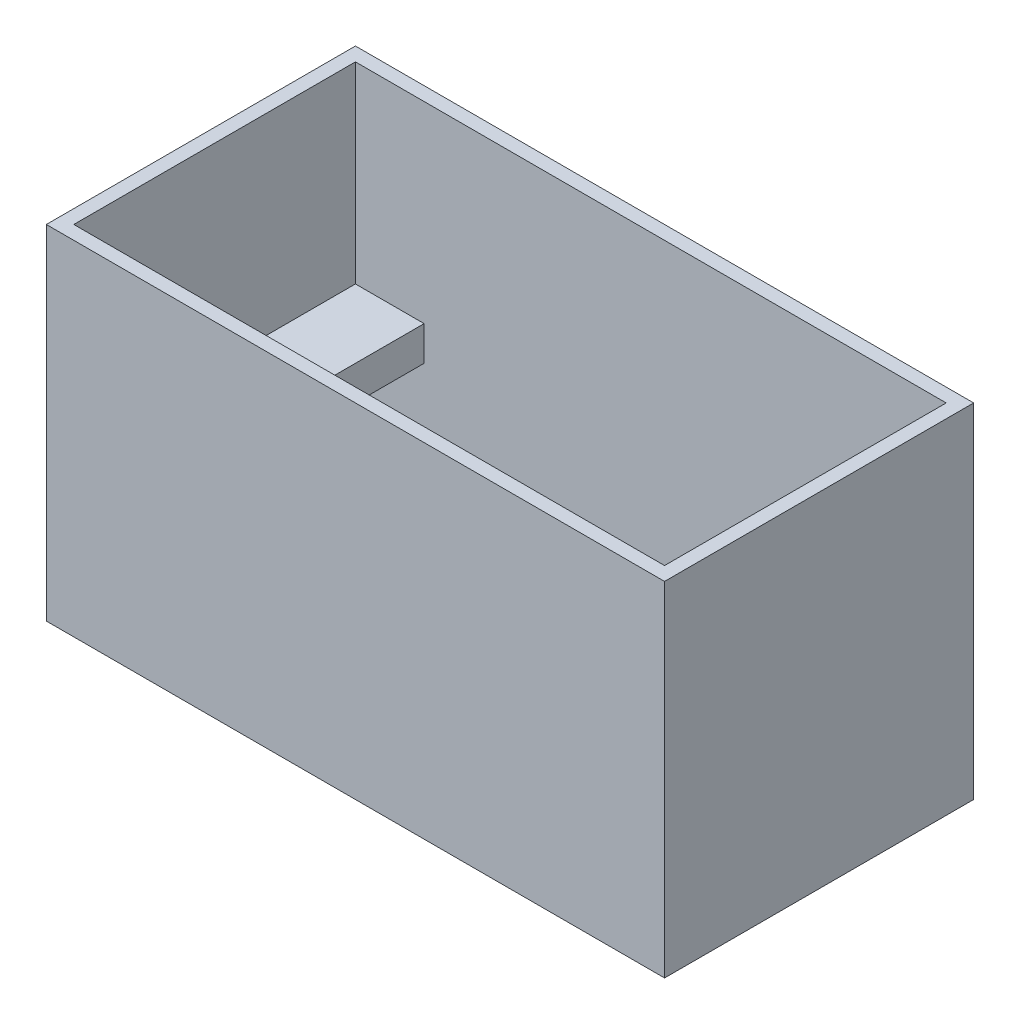
ISO-10303-21;
HEADER;
FILE_DESCRIPTION(('STEP AP214'),'2;1');
FILE_NAME('part.step','',(''),(''),'','','');
FILE_SCHEMA(('AUTOMOTIVE_DESIGN { 1 0 10303 214 1 1 1 1 }'));
ENDSEC;
DATA;
#1=APPLICATION_CONTEXT('core data for automotive mechanical design processes');
#2=APPLICATION_PROTOCOL_DEFINITION('international standard','automotive_design',2000,#1);
#3=PRODUCT_CONTEXT('',#1,'mechanical');
#4=PRODUCT('Part','Part','',(#3));
#5=PRODUCT_RELATED_PRODUCT_CATEGORY('part','',(#4));
#6=PRODUCT_DEFINITION_FORMATION('','',#4);
#7=PRODUCT_DEFINITION_CONTEXT('part definition',#1,'design');
#8=PRODUCT_DEFINITION('design','',#6,#7);
#9=PRODUCT_DEFINITION_SHAPE('','',#8);
#10=(LENGTH_UNIT() NAMED_UNIT(*) SI_UNIT(.MILLI.,.METRE.));
#11=(NAMED_UNIT(*) PLANE_ANGLE_UNIT() SI_UNIT($,.RADIAN.));
#12=(NAMED_UNIT(*) SI_UNIT($,.STERADIAN.) SOLID_ANGLE_UNIT());
#13=UNCERTAINTY_MEASURE_WITH_UNIT(LENGTH_MEASURE(1.E-05),#10,'distance_accuracy_value','');
#14=(GEOMETRIC_REPRESENTATION_CONTEXT(3) GLOBAL_UNCERTAINTY_ASSIGNED_CONTEXT((#13)) GLOBAL_UNIT_ASSIGNED_CONTEXT((#10,
#11,#12)) REPRESENTATION_CONTEXT('',''));
#15=CARTESIAN_POINT('',(0.,0.,0.));
#16=DIRECTION('',(0.,0.,1.));
#17=DIRECTION('',(1.,0.,0.));
#18=AXIS2_PLACEMENT_3D('',#15,#16,#17);
#19=CARTESIAN_POINT('',(-40.1376433452096,50.,17.0449021995127));
#20=DIRECTION('',(0.,0.,-1.));
#21=DIRECTION('',(-1.,0.,0.));
#22=AXIS2_PLACEMENT_3D('',#19,#20,#21);
#23=PLANE('',#22);
#24=DIRECTION('',(0.,-1.,0.));
#25=VECTOR('',#24,1.);
#26=CARTESIAN_POINT('',(47.8623566547904,50.,17.0449021995127));
#27=LINE('',#26,#25);
#28=CARTESIAN_POINT('',(47.8623566547904,50.,17.0449021995127));
#29=VERTEX_POINT('',#28);
#30=CARTESIAN_POINT('',(47.8623566547904,27.,17.0449021995127));
#31=VERTEX_POINT('',#30);
#32=EDGE_CURVE('E233',#29,#31,#27,.T.);
#33=ORIENTED_EDGE('',*,*,#32,.T.);
#34=DIRECTION('',(1.,0.,0.));
#35=VECTOR('',#34,1.);
#36=CARTESIAN_POINT('',(37.8623566547904,27.,17.0449021995127));
#37=LINE('',#36,#35);
#38=CARTESIAN_POINT('',(37.8623566547904,27.,17.0449021995127));
#39=VERTEX_POINT('',#38);
#40=EDGE_CURVE('E247',#39,#31,#37,.T.);
#41=ORIENTED_EDGE('',*,*,#40,.F.);
#42=DIRECTION('',(0.,1.,0.));
#43=VECTOR('',#42,1.);
#44=CARTESIAN_POINT('',(37.8623566547904,22.,17.0449021995127));
#45=LINE('',#44,#43);
#46=CARTESIAN_POINT('',(37.8623566547904,22.,17.0449021995127));
#47=VERTEX_POINT('',#46);
#48=EDGE_CURVE('E263',#47,#39,#45,.T.);
#49=ORIENTED_EDGE('',*,*,#48,.F.);
#50=DIRECTION('',(1.,0.,0.));
#51=VECTOR('',#50,1.);
#52=CARTESIAN_POINT('',(37.8623566547904,22.,17.0449021995127));
#53=LINE('',#52,#51);
#54=CARTESIAN_POINT('',(47.8623566547904,22.,17.0449021995127));
#55=VERTEX_POINT('',#54);
#56=EDGE_CURVE('E258',#47,#55,#53,.T.);
#57=ORIENTED_EDGE('',*,*,#56,.T.);
#58=CARTESIAN_POINT('',(47.8623566547904,2.,17.0449021995127));
#59=VERTEX_POINT('',#58);
#60=EDGE_CURVE('E158',#55,#59,#27,.T.);
#61=ORIENTED_EDGE('',*,*,#60,.T.);
#62=DIRECTION('',(1.,0.,0.));
#63=VECTOR('',#62,1.);
#64=CARTESIAN_POINT('',(-40.1376433452096,2.,17.0449021995127));
#65=LINE('',#64,#63);
#66=CARTESIAN_POINT('',(-40.1376433452096,2.,17.0449021995127));
#67=VERTEX_POINT('',#66);
#68=EDGE_CURVE('E150',#67,#59,#65,.T.);
#69=ORIENTED_EDGE('',*,*,#68,.F.);
#70=DIRECTION('',(0.,-1.,0.));
#71=VECTOR('',#70,1.);
#72=CARTESIAN_POINT('',(-40.1376433452096,50.,17.0449021995127));
#73=LINE('',#72,#71);
#74=CARTESIAN_POINT('',(-40.1376433452096,17.,17.0449021995127));
#75=VERTEX_POINT('',#74);
#76=EDGE_CURVE('E154',#75,#67,#73,.T.);
#77=ORIENTED_EDGE('',*,*,#76,.F.);
#78=DIRECTION('',(-1.,0.,0.));
#79=VECTOR('',#78,1.);
#80=CARTESIAN_POINT('',(-28.1376433452096,17.,17.0449021995127));
#81=LINE('',#80,#79);
#82=CARTESIAN_POINT('',(-28.1376433452096,17.,17.0449021995127));
#83=VERTEX_POINT('',#82);
#84=EDGE_CURVE('E161',#83,#75,#81,.T.);
#85=ORIENTED_EDGE('',*,*,#84,.F.);
#86=DIRECTION('',(0.,-1.,0.));
#87=VECTOR('',#86,1.);
#88=CARTESIAN_POINT('',(-28.1376433452096,17.,17.0449021995127));
#89=LINE('',#88,#87);
#90=CARTESIAN_POINT('',(-28.1376433452096,22.,17.0449021995127));
#91=VERTEX_POINT('',#90);
#92=EDGE_CURVE('E246',#91,#83,#89,.T.);
#93=ORIENTED_EDGE('',*,*,#92,.F.);
#94=DIRECTION('',(-1.,0.,0.));
#95=VECTOR('',#94,1.);
#96=CARTESIAN_POINT('',(-28.1376433452096,22.,17.0449021995127));
#97=LINE('',#96,#95);
#98=CARTESIAN_POINT('',(-38.1376433452096,22.,17.0449021995127));
#99=VERTEX_POINT('',#98);
#100=EDGE_CURVE('E240',#91,#99,#97,.T.);
#101=ORIENTED_EDGE('',*,*,#100,.T.);
#102=DIRECTION('',(0.,-1.,0.));
#103=VECTOR('',#102,1.);
#104=CARTESIAN_POINT('',(-38.1376433452096,50.,17.0449021995127));
#105=LINE('',#104,#103);
#106=CARTESIAN_POINT('',(-38.1376433452096,50.,17.0449021995127));
#107=VERTEX_POINT('',#106);
#108=EDGE_CURVE('E209',#107,#99,#105,.T.);
#109=ORIENTED_EDGE('',*,*,#108,.F.);
#110=DIRECTION('',(1.,0.,0.));
#111=VECTOR('',#110,1.);
#112=CARTESIAN_POINT('',(-40.1376433452096,50.,17.0449021995127));
#113=LINE('',#112,#111);
#114=EDGE_CURVE('E223',#107,#29,#113,.T.);
#115=ORIENTED_EDGE('',*,*,#114,.T.);
#116=EDGE_LOOP('',(#33,#41,#49,#57,#61,#69,#77,#85,#93,#101,#109,#115));
#117=FACE_BOUND('',#116,.T.);
#118=ADVANCED_FACE('F34',(#117),#23,.T.);
#119=CARTESIAN_POINT('',(-40.1376433452096,50.,-23.9550978004873));
#120=DIRECTION('',(0.,0.,1.));
#121=DIRECTION('',(1.,0.,0.));
#122=AXIS2_PLACEMENT_3D('',#119,#120,#121);
#123=PLANE('',#122);
#124=DIRECTION('',(0.,-1.,0.));
#125=VECTOR('',#124,1.);
#126=CARTESIAN_POINT('',(37.8623566547904,22.,-23.9550978004873));
#127=LINE('',#126,#125);
#128=CARTESIAN_POINT('',(37.8623566547904,27.,-23.9550978004873));
#129=VERTEX_POINT('',#128);
#130=CARTESIAN_POINT('',(37.8623566547904,22.,-23.9550978004873));
#131=VERTEX_POINT('',#130);
#132=EDGE_CURVE('E268',#129,#131,#127,.T.);
#133=ORIENTED_EDGE('',*,*,#132,.F.);
#134=DIRECTION('',(1.,0.,0.));
#135=VECTOR('',#134,1.);
#136=CARTESIAN_POINT('',(37.8623566547904,27.,-23.9550978004873));
#137=LINE('',#136,#135);
#138=CARTESIAN_POINT('',(47.8623566547904,27.,-23.9550978004873));
#139=VERTEX_POINT('',#138);
#140=EDGE_CURVE('E254',#129,#139,#137,.T.);
#141=ORIENTED_EDGE('',*,*,#140,.T.);
#142=DIRECTION('',(0.,-1.,0.));
#143=VECTOR('',#142,1.);
#144=CARTESIAN_POINT('',(47.8623566547904,50.,-23.9550978004873));
#145=LINE('',#144,#143);
#146=CARTESIAN_POINT('',(47.8623566547904,50.,-23.9550978004873));
#147=VERTEX_POINT('',#146);
#148=EDGE_CURVE('E228',#147,#139,#145,.T.);
#149=ORIENTED_EDGE('',*,*,#148,.F.);
#150=DIRECTION('',(-1.,0.,0.));
#151=VECTOR('',#150,1.);
#152=CARTESIAN_POINT('',(-40.1376433452096,50.,-23.9550978004873));
#153=LINE('',#152,#151);
#154=CARTESIAN_POINT('',(-38.1376433452096,50.,-23.9550978004873));
#155=VERTEX_POINT('',#154);
#156=EDGE_CURVE('E217',#147,#155,#153,.T.);
#157=ORIENTED_EDGE('',*,*,#156,.T.);
#158=DIRECTION('',(0.,-1.,0.));
#159=VECTOR('',#158,1.);
#160=CARTESIAN_POINT('',(-38.1376433452096,50.,-23.9550978004873));
#161=LINE('',#160,#159);
#162=CARTESIAN_POINT('',(-38.1376433452096,22.,-23.9550978004873));
#163=VERTEX_POINT('',#162);
#164=EDGE_CURVE('E219',#155,#163,#161,.T.);
#165=ORIENTED_EDGE('',*,*,#164,.T.);
#166=DIRECTION('',(1.,0.,0.));
#167=VECTOR('',#166,1.);
#168=CARTESIAN_POINT('',(-40.1376433452096,22.,-23.9550978004873));
#169=LINE('',#168,#167);
#170=CARTESIAN_POINT('',(-28.1376433452096,22.,-23.9550978004873));
#171=VERTEX_POINT('',#170);
#172=EDGE_CURVE('E180',#163,#171,#169,.T.);
#173=ORIENTED_EDGE('',*,*,#172,.T.);
#174=DIRECTION('',(0.,-1.,0.));
#175=VECTOR('',#174,1.);
#176=CARTESIAN_POINT('',(-28.1376433452096,50.,-23.9550978004873));
#177=LINE('',#176,#175);
#178=CARTESIAN_POINT('',(-28.1376433452096,17.,-23.9550978004873));
#179=VERTEX_POINT('',#178);
#180=EDGE_CURVE('E183',#171,#179,#177,.T.);
#181=ORIENTED_EDGE('',*,*,#180,.T.);
#182=DIRECTION('',(-1.,0.,0.));
#183=VECTOR('',#182,1.);
#184=CARTESIAN_POINT('',(-40.1376433452096,17.,-23.9550978004873));
#185=LINE('',#184,#183);
#186=CARTESIAN_POINT('',(-40.1376433452096,17.,-23.9550978004873));
#187=VERTEX_POINT('',#186);
#188=EDGE_CURVE('E169',#179,#187,#185,.T.);
#189=ORIENTED_EDGE('',*,*,#188,.T.);
#190=DIRECTION('',(0.,1.,0.));
#191=VECTOR('',#190,1.);
#192=CARTESIAN_POINT('',(-40.1376433452096,50.,-23.9550978004873));
#193=LINE('',#192,#191);
#194=CARTESIAN_POINT('',(-40.1376433452096,2.,-23.9550978004873));
#195=VERTEX_POINT('',#194);
#196=EDGE_CURVE('E168',#195,#187,#193,.T.);
#197=ORIENTED_EDGE('',*,*,#196,.F.);
#198=DIRECTION('',(-1.,0.,0.));
#199=VECTOR('',#198,1.);
#200=CARTESIAN_POINT('',(-40.1376433452096,2.,-23.9550978004873));
#201=LINE('',#200,#199);
#202=CARTESIAN_POINT('',(47.8623566547904,2.,-23.9550978004873));
#203=VERTEX_POINT('',#202);
#204=EDGE_CURVE('E49',#203,#195,#201,.T.);
#205=ORIENTED_EDGE('',*,*,#204,.F.);
#206=CARTESIAN_POINT('',(47.8623566547904,22.,-23.9550978004873));
#207=VERTEX_POINT('',#206);
#208=EDGE_CURVE('E231',#207,#203,#145,.T.);
#209=ORIENTED_EDGE('',*,*,#208,.F.);
#210=DIRECTION('',(1.,0.,0.));
#211=VECTOR('',#210,1.);
#212=CARTESIAN_POINT('',(37.8623566547904,22.,-23.9550978004873));
#213=LINE('',#212,#211);
#214=EDGE_CURVE('E57',#131,#207,#213,.T.);
#215=ORIENTED_EDGE('',*,*,#214,.F.);
#216=EDGE_LOOP('',(#133,#141,#149,#157,#165,#173,#181,#189,#197,#205,#209,#215));
#217=FACE_BOUND('',#216,.T.);
#218=ADVANCED_FACE('F304',(#217),#123,.T.);
#219=CARTESIAN_POINT('',(47.8623566547904,50.,-25.9550978004873));
#220=DIRECTION('',(-1.,0.,0.));
#221=DIRECTION('',(0.,0.,1.));
#222=AXIS2_PLACEMENT_3D('',#219,#220,#221);
#223=PLANE('',#222);
#224=ORIENTED_EDGE('',*,*,#148,.T.);
#225=DIRECTION('',(0.,0.,-1.));
#226=VECTOR('',#225,1.);
#227=CARTESIAN_POINT('',(47.8623566547904,27.,17.0449021995127));
#228=LINE('',#227,#226);
#229=EDGE_CURVE('E264',#31,#139,#228,.T.);
#230=ORIENTED_EDGE('',*,*,#229,.F.);
#231=ORIENTED_EDGE('',*,*,#32,.F.);
#232=DIRECTION('',(0.,0.,-1.));
#233=VECTOR('',#232,1.);
#234=CARTESIAN_POINT('',(47.8623566547904,50.,-25.9550978004873));
#235=LINE('',#234,#233);
#236=EDGE_CURVE('E220',#29,#147,#235,.T.);
#237=ORIENTED_EDGE('',*,*,#236,.T.);
#238=EDGE_LOOP('',(#224,#230,#231,#237));
#239=FACE_BOUND('',#238,.T.);
#240=ADVANCED_FACE('F305',(#239),#223,.T.);
#241=ORIENTED_EDGE('',*,*,#60,.F.);
#242=DIRECTION('',(0.,0.,1.));
#243=VECTOR('',#242,1.);
#244=CARTESIAN_POINT('',(47.8623566547904,22.,17.0449021995127));
#245=LINE('',#244,#243);
#246=EDGE_CURVE('E261',#207,#55,#245,.T.);
#247=ORIENTED_EDGE('',*,*,#246,.F.);
#248=ORIENTED_EDGE('',*,*,#208,.T.);
#249=DIRECTION('',(0.,0.,-1.));
#250=VECTOR('',#249,1.);
#251=CARTESIAN_POINT('',(47.8623566547904,2.,-25.9550978004873));
#252=LINE('',#251,#250);
#253=EDGE_CURVE('E160',#59,#203,#252,.T.);
#254=ORIENTED_EDGE('',*,*,#253,.F.);
#255=EDGE_LOOP('',(#241,#247,#248,#254));
#256=FACE_BOUND('',#255,.T.);
#257=ADVANCED_FACE('F345',(#256),#223,.T.);
#258=CARTESIAN_POINT('',(-38.1376433452096,50.,-25.9550978004873));
#259=DIRECTION('',(1.,0.,0.));
#260=DIRECTION('',(0.,0.,-1.));
#261=AXIS2_PLACEMENT_3D('',#258,#259,#260);
#262=PLANE('',#261);
#263=ORIENTED_EDGE('',*,*,#108,.T.);
#264=DIRECTION('',(0.,0.,1.));
#265=VECTOR('',#264,1.);
#266=CARTESIAN_POINT('',(-38.1376433452096,22.,17.0449021995127));
#267=LINE('',#266,#265);
#268=EDGE_CURVE('E244',#163,#99,#267,.T.);
#269=ORIENTED_EDGE('',*,*,#268,.F.);
#270=ORIENTED_EDGE('',*,*,#164,.F.);
#271=DIRECTION('',(0.,0.,1.));
#272=VECTOR('',#271,1.);
#273=CARTESIAN_POINT('',(-38.1376433452096,50.,-25.9550978004873));
#274=LINE('',#273,#272);
#275=EDGE_CURVE('E225',#155,#107,#274,.T.);
#276=ORIENTED_EDGE('',*,*,#275,.T.);
#277=EDGE_LOOP('',(#263,#269,#270,#276));
#278=FACE_BOUND('',#277,.T.);
#279=ADVANCED_FACE('F316',(#278),#262,.T.);
#280=CARTESIAN_POINT('',(-40.1376433452096,50.,-25.9550978004873));
#281=DIRECTION('',(1.,0.,0.));
#282=DIRECTION('',(0.,0.,-1.));
#283=AXIS2_PLACEMENT_3D('',#280,#281,#282);
#284=PLANE('',#283);
#285=DIRECTION('',(0.,0.,1.));
#286=VECTOR('',#285,1.);
#287=CARTESIAN_POINT('',(-40.1376433452096,17.,-25.9550978004873));
#288=LINE('',#287,#286);
#289=EDGE_CURVE('E173',#187,#75,#288,.T.);
#290=ORIENTED_EDGE('',*,*,#289,.T.);
#291=ORIENTED_EDGE('',*,*,#76,.T.);
#292=DIRECTION('',(0.,0.,-1.));
#293=VECTOR('',#292,1.);
#294=CARTESIAN_POINT('',(-40.1376433452096,2.,-25.9550978004873));
#295=LINE('',#294,#293);
#296=EDGE_CURVE('E164',#67,#195,#295,.T.);
#297=ORIENTED_EDGE('',*,*,#296,.T.);
#298=ORIENTED_EDGE('',*,*,#196,.T.);
#299=EDGE_LOOP('',(#290,#291,#297,#298));
#300=FACE_BOUND('',#299,.T.);
#301=DIRECTION('',(0.,0.,1.));
#302=VECTOR('',#301,1.);
#303=CARTESIAN_POINT('',(-40.1376433452096,0.,-25.9550978004873));
#304=LINE('',#303,#302);
#305=CARTESIAN_POINT('',(-40.1376433452096,0.,-25.9550978004873));
#306=VERTEX_POINT('',#305);
#307=CARTESIAN_POINT('',(-40.1376433452096,0.,19.0449021995127));
#308=VERTEX_POINT('',#307);
#309=EDGE_CURVE('E206',#306,#308,#304,.T.);
#310=ORIENTED_EDGE('',*,*,#309,.T.);
#311=DIRECTION('',(0.,-1.,0.));
#312=VECTOR('',#311,1.);
#313=CARTESIAN_POINT('',(-40.1376433452096,50.,19.0449021995127));
#314=LINE('',#313,#312);
#315=CARTESIAN_POINT('',(-40.1376433452096,50.,19.0449021995127));
#316=VERTEX_POINT('',#315);
#317=EDGE_CURVE('E186',#316,#308,#314,.T.);
#318=ORIENTED_EDGE('',*,*,#317,.F.);
#319=DIRECTION('',(0.,0.,1.));
#320=VECTOR('',#319,1.);
#321=CARTESIAN_POINT('',(-40.1376433452096,50.,-25.9550978004873));
#322=LINE('',#321,#320);
#323=CARTESIAN_POINT('',(-40.1376433452096,50.,-25.9550978004873));
#324=VERTEX_POINT('',#323);
#325=EDGE_CURVE('E201',#324,#316,#322,.T.);
#326=ORIENTED_EDGE('',*,*,#325,.F.);
#327=DIRECTION('',(0.,-1.,0.));
#328=VECTOR('',#327,1.);
#329=CARTESIAN_POINT('',(-40.1376433452096,50.,-25.9550978004873));
#330=LINE('',#329,#328);
#331=EDGE_CURVE('E195',#324,#306,#330,.T.);
#332=ORIENTED_EDGE('',*,*,#331,.T.);
#333=EDGE_LOOP('',(#310,#318,#326,#332));
#334=FACE_BOUND('',#333,.T.);
#335=ADVANCED_FACE('F36',(#300,#334),#284,.F.);
#336=CARTESIAN_POINT('',(-40.1376433452096,50.,19.0449021995127));
#337=DIRECTION('',(0.,0.,-1.));
#338=DIRECTION('',(-1.,0.,0.));
#339=AXIS2_PLACEMENT_3D('',#336,#337,#338);
#340=PLANE('',#339);
#341=DIRECTION('',(1.,0.,0.));
#342=VECTOR('',#341,1.);
#343=CARTESIAN_POINT('',(-40.1376433452096,0.,19.0449021995127));
#344=LINE('',#343,#342);
#345=CARTESIAN_POINT('',(49.8623566547904,0.,19.0449021995127));
#346=VERTEX_POINT('',#345);
#347=EDGE_CURVE('E204',#308,#346,#344,.T.);
#348=ORIENTED_EDGE('',*,*,#347,.T.);
#349=DIRECTION('',(0.,-1.,0.));
#350=VECTOR('',#349,1.);
#351=CARTESIAN_POINT('',(49.8623566547904,50.,19.0449021995127));
#352=LINE('',#351,#350);
#353=CARTESIAN_POINT('',(49.8623566547904,50.,19.0449021995127));
#354=VERTEX_POINT('',#353);
#355=EDGE_CURVE('E189',#354,#346,#352,.T.);
#356=ORIENTED_EDGE('',*,*,#355,.F.);
#357=DIRECTION('',(1.,0.,0.));
#358=VECTOR('',#357,1.);
#359=CARTESIAN_POINT('',(-40.1376433452096,50.,19.0449021995127));
#360=LINE('',#359,#358);
#361=EDGE_CURVE('E213',#316,#354,#360,.T.);
#362=ORIENTED_EDGE('',*,*,#361,.F.);
#363=ORIENTED_EDGE('',*,*,#317,.T.);
#364=EDGE_LOOP('',(#348,#356,#362,#363));
#365=FACE_BOUND('',#364,.T.);
#366=ADVANCED_FACE('F358',(#365),#340,.F.);
#367=CARTESIAN_POINT('',(49.8623566547904,50.,-25.9550978004873));
#368=DIRECTION('',(-1.,0.,0.));
#369=DIRECTION('',(0.,0.,1.));
#370=AXIS2_PLACEMENT_3D('',#367,#368,#369);
#371=PLANE('',#370);
#372=DIRECTION('',(0.,0.,-1.));
#373=VECTOR('',#372,1.);
#374=CARTESIAN_POINT('',(49.8623566547904,0.,-25.9550978004873));
#375=LINE('',#374,#373);
#376=CARTESIAN_POINT('',(49.8623566547904,0.,-25.9550978004873));
#377=VERTEX_POINT('',#376);
#378=EDGE_CURVE('E202',#346,#377,#375,.T.);
#379=ORIENTED_EDGE('',*,*,#378,.T.);
#380=DIRECTION('',(0.,-1.,0.));
#381=VECTOR('',#380,1.);
#382=CARTESIAN_POINT('',(49.8623566547904,50.,-25.9550978004873));
#383=LINE('',#382,#381);
#384=CARTESIAN_POINT('',(49.8623566547904,50.,-25.9550978004873));
#385=VERTEX_POINT('',#384);
#386=EDGE_CURVE('E192',#385,#377,#383,.T.);
#387=ORIENTED_EDGE('',*,*,#386,.F.);
#388=DIRECTION('',(0.,0.,-1.));
#389=VECTOR('',#388,1.);
#390=CARTESIAN_POINT('',(49.8623566547904,50.,-25.9550978004873));
#391=LINE('',#390,#389);
#392=EDGE_CURVE('E211',#354,#385,#391,.T.);
#393=ORIENTED_EDGE('',*,*,#392,.F.);
#394=ORIENTED_EDGE('',*,*,#355,.T.);
#395=EDGE_LOOP('',(#379,#387,#393,#394));
#396=FACE_BOUND('',#395,.T.);
#397=ADVANCED_FACE('F355',(#396),#371,.F.);
#398=CARTESIAN_POINT('',(-40.1376433452096,50.,-25.9550978004873));
#399=DIRECTION('',(0.,0.,1.));
#400=DIRECTION('',(1.,0.,0.));
#401=AXIS2_PLACEMENT_3D('',#398,#399,#400);
#402=PLANE('',#401);
#403=DIRECTION('',(-1.,0.,0.));
#404=VECTOR('',#403,1.);
#405=CARTESIAN_POINT('',(-40.1376433452096,0.,-25.9550978004873));
#406=LINE('',#405,#404);
#407=EDGE_CURVE('E199',#377,#306,#406,.T.);
#408=ORIENTED_EDGE('',*,*,#407,.T.);
#409=ORIENTED_EDGE('',*,*,#331,.F.);
#410=DIRECTION('',(-1.,0.,0.));
#411=VECTOR('',#410,1.);
#412=CARTESIAN_POINT('',(-40.1376433452096,50.,-25.9550978004873));
#413=LINE('',#412,#411);
#414=EDGE_CURVE('E198',#385,#324,#413,.T.);
#415=ORIENTED_EDGE('',*,*,#414,.F.);
#416=ORIENTED_EDGE('',*,*,#386,.T.);
#417=EDGE_LOOP('',(#408,#409,#415,#416));
#418=FACE_BOUND('',#417,.T.);
#419=ADVANCED_FACE('F349',(#418),#402,.F.);
#420=CARTESIAN_POINT('',(0.,50.,0.));
#421=DIRECTION('',(0.,1.,0.));
#422=DIRECTION('',(0.,0.,1.));
#423=AXIS2_PLACEMENT_3D('',#420,#421,#422);
#424=PLANE('',#423);
#425=ORIENTED_EDGE('',*,*,#275,.F.);
#426=ORIENTED_EDGE('',*,*,#156,.F.);
#427=ORIENTED_EDGE('',*,*,#236,.F.);
#428=ORIENTED_EDGE('',*,*,#114,.F.);
#429=EDGE_LOOP('',(#425,#426,#427,#428));
#430=FACE_BOUND('',#429,.T.);
#431=ORIENTED_EDGE('',*,*,#325,.T.);
#432=ORIENTED_EDGE('',*,*,#361,.T.);
#433=ORIENTED_EDGE('',*,*,#392,.T.);
#434=ORIENTED_EDGE('',*,*,#414,.T.);
#435=EDGE_LOOP('',(#431,#432,#433,#434));
#436=FACE_BOUND('',#435,.T.);
#437=ADVANCED_FACE('F311',(#430,#436),#424,.T.);
#438=CARTESIAN_POINT('',(0.,0.,0.));
#439=DIRECTION('',(0.,1.,0.));
#440=DIRECTION('',(0.,0.,1.));
#441=AXIS2_PLACEMENT_3D('',#438,#439,#440);
#442=PLANE('',#441);
#443=ORIENTED_EDGE('',*,*,#309,.F.);
#444=ORIENTED_EDGE('',*,*,#407,.F.);
#445=ORIENTED_EDGE('',*,*,#378,.F.);
#446=ORIENTED_EDGE('',*,*,#347,.F.);
#447=EDGE_LOOP('',(#443,#444,#445,#446));
#448=FACE_BOUND('',#447,.T.);
#449=ADVANCED_FACE('F334',(#448),#442,.F.);
#450=CARTESIAN_POINT('',(0.,2.,0.));
#451=DIRECTION('',(0.,1.,0.));
#452=DIRECTION('',(0.,0.,1.));
#453=AXIS2_PLACEMENT_3D('',#450,#451,#452);
#454=PLANE('',#453);
#455=ORIENTED_EDGE('',*,*,#204,.T.);
#456=ORIENTED_EDGE('',*,*,#296,.F.);
#457=ORIENTED_EDGE('',*,*,#68,.T.);
#458=ORIENTED_EDGE('',*,*,#253,.T.);
#459=EDGE_LOOP('',(#455,#456,#457,#458));
#460=FACE_BOUND('',#459,.T.);
#461=ADVANCED_FACE('F165',(#460),#454,.T.);
#462=CARTESIAN_POINT('',(-28.1376433452096,17.,17.0449021995127));
#463=DIRECTION('',(0.,1.,0.));
#464=DIRECTION('',(0.,0.,1.));
#465=AXIS2_PLACEMENT_3D('',#462,#463,#464);
#466=PLANE('',#465);
#467=ORIENTED_EDGE('',*,*,#188,.F.);
#468=DIRECTION('',(0.,0.,-1.));
#469=VECTOR('',#468,1.);
#470=CARTESIAN_POINT('',(-28.1376433452096,17.,17.0449021995127));
#471=LINE('',#470,#469);
#472=EDGE_CURVE('E249',#83,#179,#471,.T.);
#473=ORIENTED_EDGE('',*,*,#472,.F.);
#474=ORIENTED_EDGE('',*,*,#84,.T.);
#475=ORIENTED_EDGE('',*,*,#289,.F.);
#476=EDGE_LOOP('',(#467,#473,#474,#475));
#477=FACE_BOUND('',#476,.T.);
#478=ADVANCED_FACE('F326',(#477),#466,.F.);
#479=CARTESIAN_POINT('',(-28.1376433452096,22.,17.0449021995127));
#480=DIRECTION('',(0.,-1.,0.));
#481=DIRECTION('',(0.,0.,-1.));
#482=AXIS2_PLACEMENT_3D('',#479,#480,#481);
#483=PLANE('',#482);
#484=ORIENTED_EDGE('',*,*,#172,.F.);
#485=ORIENTED_EDGE('',*,*,#268,.T.);
#486=ORIENTED_EDGE('',*,*,#100,.F.);
#487=DIRECTION('',(0.,0.,1.));
#488=VECTOR('',#487,1.);
#489=CARTESIAN_POINT('',(-28.1376433452096,22.,17.0449021995127));
#490=LINE('',#489,#488);
#491=EDGE_CURVE('E243',#171,#91,#490,.T.);
#492=ORIENTED_EDGE('',*,*,#491,.F.);
#493=EDGE_LOOP('',(#484,#485,#486,#492));
#494=FACE_BOUND('',#493,.T.);
#495=ADVANCED_FACE('F320',(#494),#483,.F.);
#496=CARTESIAN_POINT('',(-28.1376433452096,0.,0.));
#497=DIRECTION('',(-1.,0.,0.));
#498=DIRECTION('',(0.,0.,1.));
#499=AXIS2_PLACEMENT_3D('',#496,#497,#498);
#500=PLANE('',#499);
#501=ORIENTED_EDGE('',*,*,#180,.F.);
#502=ORIENTED_EDGE('',*,*,#491,.T.);
#503=ORIENTED_EDGE('',*,*,#92,.T.);
#504=ORIENTED_EDGE('',*,*,#472,.T.);
#505=EDGE_LOOP('',(#501,#502,#503,#504));
#506=FACE_BOUND('',#505,.T.);
#507=ADVANCED_FACE('F293',(#506),#500,.F.);
#508=CARTESIAN_POINT('',(37.8623566547904,27.,17.0449021995127));
#509=DIRECTION('',(0.,-1.,0.));
#510=DIRECTION('',(0.,0.,-1.));
#511=AXIS2_PLACEMENT_3D('',#508,#509,#510);
#512=PLANE('',#511);
#513=CARTESIAN_POINT('',(42.8820462046033,27.,9.3422727677501));
#514=DIRECTION('',(0.,-1.,0.));
#515=DIRECTION('',(0.,0.,-1.));
#516=AXIS2_PLACEMENT_3D('',#513,#514,#515);
#517=CIRCLE('',#516,2.5);
#518=CARTESIAN_POINT('',(42.8820462046033,27.,6.8422727677501));
#519=VERTEX_POINT('',#518);
#520=EDGE_CURVE('E11',#519,#519,#517,.F.);
#521=ORIENTED_EDGE('',*,*,#520,.F.);
#522=EDGE_LOOP('',(#521));
#523=FACE_BOUND('',#522,.T.);
#524=CARTESIAN_POINT('',(42.895820428015,27.,-16.1851628845103));
#525=DIRECTION('',(0.,-1.,0.));
#526=DIRECTION('',(0.,0.,-1.));
#527=AXIS2_PLACEMENT_3D('',#524,#525,#526);
#528=CIRCLE('',#527,2.5);
#529=CARTESIAN_POINT('',(42.895820428015,27.,-18.6851628845103));
#530=VERTEX_POINT('',#529);
#531=EDGE_CURVE('E42',#530,#530,#528,.F.);
#532=ORIENTED_EDGE('',*,*,#531,.F.);
#533=EDGE_LOOP('',(#532));
#534=FACE_BOUND('',#533,.T.);
#535=ORIENTED_EDGE('',*,*,#229,.T.);
#536=ORIENTED_EDGE('',*,*,#140,.F.);
#537=DIRECTION('',(0.,0.,-1.));
#538=VECTOR('',#537,1.);
#539=CARTESIAN_POINT('',(37.8623566547904,27.,17.0449021995127));
#540=LINE('',#539,#538);
#541=EDGE_CURVE('E270',#39,#129,#540,.T.);
#542=ORIENTED_EDGE('',*,*,#541,.F.);
#543=ORIENTED_EDGE('',*,*,#40,.T.);
#544=EDGE_LOOP('',(#535,#536,#542,#543));
#545=FACE_BOUND('',#544,.T.);
#546=ADVANCED_FACE('F289',(#523,#534,#545),#512,.F.);
#547=CARTESIAN_POINT('',(37.8623566547904,22.,17.0449021995127));
#548=DIRECTION('',(0.,1.,0.));
#549=DIRECTION('',(0.,0.,1.));
#550=AXIS2_PLACEMENT_3D('',#547,#548,#549);
#551=PLANE('',#550);
#552=ORIENTED_EDGE('',*,*,#246,.T.);
#553=ORIENTED_EDGE('',*,*,#56,.F.);
#554=DIRECTION('',(0.,0.,1.));
#555=VECTOR('',#554,1.);
#556=CARTESIAN_POINT('',(37.8623566547904,22.,17.0449021995127));
#557=LINE('',#556,#555);
#558=EDGE_CURVE('E260',#131,#47,#557,.T.);
#559=ORIENTED_EDGE('',*,*,#558,.F.);
#560=ORIENTED_EDGE('',*,*,#214,.T.);
#561=EDGE_LOOP('',(#552,#553,#559,#560));
#562=FACE_BOUND('',#561,.T.);
#563=ADVANCED_FACE('F292',(#562),#551,.F.);
#564=CARTESIAN_POINT('',(37.8623566547904,0.,0.));
#565=DIRECTION('',(-1.,0.,0.));
#566=DIRECTION('',(0.,0.,1.));
#567=AXIS2_PLACEMENT_3D('',#564,#565,#566);
#568=PLANE('',#567);
#569=ORIENTED_EDGE('',*,*,#48,.T.);
#570=ORIENTED_EDGE('',*,*,#541,.T.);
#571=ORIENTED_EDGE('',*,*,#132,.T.);
#572=ORIENTED_EDGE('',*,*,#558,.T.);
#573=EDGE_LOOP('',(#569,#570,#571,#572));
#574=FACE_BOUND('',#573,.T.);
#575=ADVANCED_FACE('F388',(#574),#568,.T.);
#576=CARTESIAN_POINT('',(42.895820428015,27.,-16.1851628845103));
#577=DIRECTION('',(0.,-1.,0.));
#578=DIRECTION('',(0.,0.,1.));
#579=AXIS2_PLACEMENT_3D('',#576,#577,#578);
#580=CONICAL_SURFACE('',#579,2.5,0.0523598775598299);
#581=CARTESIAN_POINT('',(42.895820428015,37.,-16.1851628845103));
#582=DIRECTION('',(0.,1.,0.));
#583=DIRECTION('',(0.,0.,1.));
#584=AXIS2_PLACEMENT_3D('',#581,#582,#583);
#585=CIRCLE('',#584,1.97592220716959);
#586=CARTESIAN_POINT('',(42.895820428015,37.,-14.2092406773407));
#587=VERTEX_POINT('',#586);
#588=EDGE_CURVE('E266',#587,#587,#585,.T.);
#589=ORIENTED_EDGE('',*,*,#588,.F.);
#590=EDGE_LOOP('',(#589));
#591=FACE_BOUND('',#590,.T.);
#592=ORIENTED_EDGE('',*,*,#531,.T.);
#593=EDGE_LOOP('',(#592));
#594=FACE_BOUND('',#593,.T.);
#595=ADVANCED_FACE('F390',(#591,#594),#580,.T.);
#596=CARTESIAN_POINT('',(42.895820428015,37.,-16.1851628845103));
#597=DIRECTION('',(0.,1.,0.));
#598=DIRECTION('',(0.,0.,1.));
#599=AXIS2_PLACEMENT_3D('',#596,#597,#598);
#600=PLANE('',#599);
#601=ORIENTED_EDGE('',*,*,#588,.T.);
#602=EDGE_LOOP('',(#601));
#603=FACE_BOUND('',#602,.T.);
#604=ADVANCED_FACE('F285',(#603),#600,.T.);
#605=CARTESIAN_POINT('',(42.8820462046033,27.,9.3422727677501));
#606=DIRECTION('',(0.,-1.,0.));
#607=DIRECTION('',(0.,0.,1.));
#608=AXIS2_PLACEMENT_3D('',#605,#606,#607);
#609=CONICAL_SURFACE('',#608,2.5,0.0523598775598299);
#610=CARTESIAN_POINT('',(42.8820462046033,37.,9.3422727677501));
#611=DIRECTION('',(0.,1.,0.));
#612=DIRECTION('',(0.,0.,1.));
#613=AXIS2_PLACEMENT_3D('',#610,#611,#612);
#614=CIRCLE('',#613,1.97592220716959);
#615=CARTESIAN_POINT('',(42.8820462046033,37.,11.3181949749197));
#616=VERTEX_POINT('',#615);
#617=EDGE_CURVE('E276',#616,#616,#614,.T.);
#618=ORIENTED_EDGE('',*,*,#617,.F.);
#619=EDGE_LOOP('',(#618));
#620=FACE_BOUND('',#619,.T.);
#621=ORIENTED_EDGE('',*,*,#520,.T.);
#622=EDGE_LOOP('',(#621));
#623=FACE_BOUND('',#622,.T.);
#624=ADVANCED_FACE('F282',(#620,#623),#609,.T.);
#625=CARTESIAN_POINT('',(42.8820462046033,37.,9.3422727677501));
#626=DIRECTION('',(0.,1.,0.));
#627=DIRECTION('',(0.,0.,1.));
#628=AXIS2_PLACEMENT_3D('',#625,#626,#627);
#629=PLANE('',#628);
#630=ORIENTED_EDGE('',*,*,#617,.T.);
#631=EDGE_LOOP('',(#630));
#632=FACE_BOUND('',#631,.T.);
#633=ADVANCED_FACE('F280',(#632),#629,.T.);
#634=CLOSED_SHELL('',(#118,#218,#240,#257,#279,#335,#366,#397,#419,#437,#449,#461,#478,#495,
#507,#546,#563,#575,#595,#604,#624,#633));
#635=MANIFOLD_SOLID_BREP('B2',#634);
#636=ADVANCED_BREP_SHAPE_REPRESENTATION('',(#18,#635),#14);
#637=SHAPE_DEFINITION_REPRESENTATION(#9,#636);
ENDSEC;
END-ISO-10303-21;
